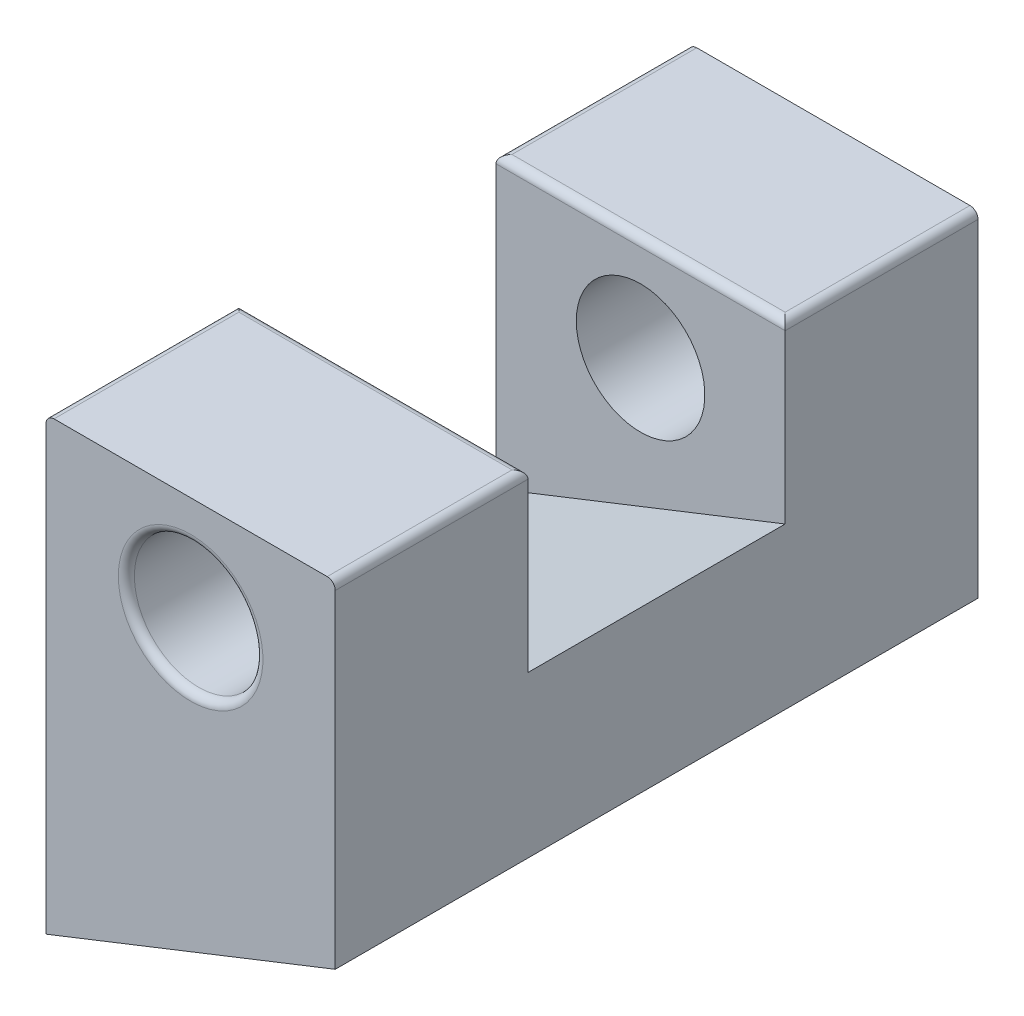
ISO-10303-21;
HEADER;
FILE_DESCRIPTION(('STEP AP214'),'2;1');
FILE_NAME('part.step','',(''),(''),'','','');
FILE_SCHEMA(('AUTOMOTIVE_DESIGN { 1 0 10303 214 1 1 1 1 }'));
ENDSEC;
DATA;
#1=APPLICATION_CONTEXT('core data for automotive mechanical design processes');
#2=APPLICATION_PROTOCOL_DEFINITION('international standard','automotive_design',2000,#1);
#3=PRODUCT_CONTEXT('',#1,'mechanical');
#4=PRODUCT('Part','Part','',(#3));
#5=PRODUCT_RELATED_PRODUCT_CATEGORY('part','',(#4));
#6=PRODUCT_DEFINITION_FORMATION('','',#4);
#7=PRODUCT_DEFINITION_CONTEXT('part definition',#1,'design');
#8=PRODUCT_DEFINITION('design','',#6,#7);
#9=PRODUCT_DEFINITION_SHAPE('','',#8);
#10=(LENGTH_UNIT() NAMED_UNIT(*) SI_UNIT(.MILLI.,.METRE.));
#11=(NAMED_UNIT(*) PLANE_ANGLE_UNIT() SI_UNIT($,.RADIAN.));
#12=(NAMED_UNIT(*) SI_UNIT($,.STERADIAN.) SOLID_ANGLE_UNIT());
#13=UNCERTAINTY_MEASURE_WITH_UNIT(LENGTH_MEASURE(1.E-05),#10,'distance_accuracy_value','');
#14=(GEOMETRIC_REPRESENTATION_CONTEXT(3) GLOBAL_UNCERTAINTY_ASSIGNED_CONTEXT((#13)) GLOBAL_UNIT_ASSIGNED_CONTEXT((#10,
#11,#12)) REPRESENTATION_CONTEXT('',''));
#15=CARTESIAN_POINT('',(0.,0.,0.));
#16=DIRECTION('',(0.,0.,1.));
#17=DIRECTION('',(1.,0.,0.));
#18=AXIS2_PLACEMENT_3D('',#15,#16,#17);
#19=CARTESIAN_POINT('',(0.,0.,20.));
#20=DIRECTION('',(0.,-1.,0.));
#21=DIRECTION('',(0.,0.,-1.));
#22=AXIS2_PLACEMENT_3D('',#19,#20,#21);
#23=PLANE('',#22);
#24=DIRECTION('',(-1.,0.,0.));
#25=VECTOR('',#24,1.);
#26=CARTESIAN_POINT('',(0.,0.,8.5));
#27=LINE('',#26,#25);
#28=CARTESIAN_POINT('',(17.5,0.,8.5));
#29=VERTEX_POINT('',#28);
#30=CARTESIAN_POINT('',(0.5,0.,8.5));
#31=VERTEX_POINT('',#30);
#32=EDGE_CURVE('E48',#29,#31,#27,.T.);
#33=ORIENTED_EDGE('',*,*,#32,.T.);
#34=DIRECTION('',(0.,0.,-1.));
#35=VECTOR('',#34,1.);
#36=CARTESIAN_POINT('',(0.5,0.,20.));
#37=LINE('',#36,#35);
#38=CARTESIAN_POINT('',(0.5,0.,20.));
#39=VERTEX_POINT('',#38);
#40=EDGE_CURVE('E201',#31,#39,#37,.F.);
#41=ORIENTED_EDGE('',*,*,#40,.T.);
#42=DIRECTION('',(-1.,0.,0.));
#43=VECTOR('',#42,1.);
#44=CARTESIAN_POINT('',(0.,0.,20.));
#45=LINE('',#44,#43);
#46=CARTESIAN_POINT('',(17.5,0.,20.));
#47=VERTEX_POINT('',#46);
#48=EDGE_CURVE('E163',#47,#39,#45,.T.);
#49=ORIENTED_EDGE('',*,*,#48,.F.);
#50=DIRECTION('',(0.,0.,-1.));
#51=VECTOR('',#50,1.);
#52=CARTESIAN_POINT('',(17.5,0.,20.));
#53=LINE('',#52,#51);
#54=EDGE_CURVE('E53',#47,#29,#53,.T.);
#55=ORIENTED_EDGE('',*,*,#54,.T.);
#56=EDGE_LOOP('',(#33,#41,#49,#55));
#57=FACE_BOUND('',#56,.T.);
#58=ADVANCED_FACE('F33',(#57),#23,.F.);
#59=CARTESIAN_POINT('',(0.,-28.021,20.));
#60=DIRECTION('',(1.,0.,0.));
#61=DIRECTION('',(0.,0.,-1.));
#62=AXIS2_PLACEMENT_3D('',#59,#60,#61);
#63=PLANE('',#62);
#64=DIRECTION('',(0.,-1.,0.));
#65=VECTOR('',#64,1.);
#66=CARTESIAN_POINT('',(0.,-18.021,-8.));
#67=LINE('',#66,#65);
#68=CARTESIAN_POINT('',(0.,-0.500000000000007,-8.));
#69=VERTEX_POINT('',#68);
#70=CARTESIAN_POINT('',(0.,-18.021,-8.));
#71=VERTEX_POINT('',#70);
#72=EDGE_CURVE('E122',#69,#71,#67,.T.);
#73=ORIENTED_EDGE('',*,*,#72,.F.);
#74=DIRECTION('',(0.,0.,-1.));
#75=VECTOR('',#74,1.);
#76=CARTESIAN_POINT('',(0.,-0.5,20.));
#77=LINE('',#76,#75);
#78=CARTESIAN_POINT('',(0.,-0.5,-20.));
#79=VERTEX_POINT('',#78);
#80=EDGE_CURVE('E197',#69,#79,#77,.T.);
#81=ORIENTED_EDGE('',*,*,#80,.T.);
#82=DIRECTION('',(0.,-1.,0.));
#83=VECTOR('',#82,1.);
#84=CARTESIAN_POINT('',(0.,-28.021,-20.));
#85=LINE('',#84,#83);
#86=CARTESIAN_POINT('',(0.,-28.021,-20.));
#87=VERTEX_POINT('',#86);
#88=EDGE_CURVE('E150',#79,#87,#85,.T.);
#89=ORIENTED_EDGE('',*,*,#88,.T.);
#90=DIRECTION('',(0.,0.,-1.));
#91=VECTOR('',#90,1.);
#92=CARTESIAN_POINT('',(0.,-28.021,20.));
#93=LINE('',#92,#91);
#94=CARTESIAN_POINT('',(0.,-28.021,20.));
#95=VERTEX_POINT('',#94);
#96=EDGE_CURVE('E177',#95,#87,#93,.T.);
#97=ORIENTED_EDGE('',*,*,#96,.F.);
#98=DIRECTION('',(0.,-1.,0.));
#99=VECTOR('',#98,1.);
#100=CARTESIAN_POINT('',(0.,-28.021,20.));
#101=LINE('',#100,#99);
#102=CARTESIAN_POINT('',(0.,-0.5,20.));
#103=VERTEX_POINT('',#102);
#104=EDGE_CURVE('E155',#103,#95,#101,.T.);
#105=ORIENTED_EDGE('',*,*,#104,.F.);
#106=DIRECTION('',(0.,0.,-1.));
#107=VECTOR('',#106,1.);
#108=CARTESIAN_POINT('',(0.,-0.5,20.));
#109=LINE('',#108,#107);
#110=CARTESIAN_POINT('',(0.,-0.500000000000007,8.));
#111=VERTEX_POINT('',#110);
#112=EDGE_CURVE('E195',#103,#111,#109,.T.);
#113=ORIENTED_EDGE('',*,*,#112,.T.);
#114=DIRECTION('',(0.,-1.,0.));
#115=VECTOR('',#114,1.);
#116=CARTESIAN_POINT('',(0.,-18.021,8.));
#117=LINE('',#116,#115);
#118=CARTESIAN_POINT('',(0.,-18.021,8.));
#119=VERTEX_POINT('',#118);
#120=EDGE_CURVE('E148',#111,#119,#117,.T.);
#121=ORIENTED_EDGE('',*,*,#120,.T.);
#122=DIRECTION('',(0.,0.,1.));
#123=VECTOR('',#122,1.);
#124=CARTESIAN_POINT('',(0.,-18.021,-8.));
#125=LINE('',#124,#123);
#126=EDGE_CURVE('E139',#71,#119,#125,.T.);
#127=ORIENTED_EDGE('',*,*,#126,.F.);
#128=EDGE_LOOP('',(#73,#81,#89,#97,#105,#113,#121,#127));
#129=FACE_BOUND('',#128,.T.);
#130=ADVANCED_FACE('F145',(#129),#63,.F.);
#131=CARTESIAN_POINT('',(18.,-20.916,20.));
#132=DIRECTION('',(-0.367154769153486,0.930159865554223,0.));
#133=DIRECTION('',(-0.930159865554223,-0.367154769153486,0.));
#134=AXIS2_PLACEMENT_3D('',#131,#132,#133);
#135=PLANE('',#134);
#136=DIRECTION('',(0.930159865554223,0.367154769153486,0.));
#137=VECTOR('',#136,1.);
#138=CARTESIAN_POINT('',(18.,-20.916,-20.));
#139=LINE('',#138,#137);
#140=CARTESIAN_POINT('',(18.,-20.916,-20.));
#141=VERTEX_POINT('',#140);
#142=EDGE_CURVE('E168',#87,#141,#139,.T.);
#143=ORIENTED_EDGE('',*,*,#142,.T.);
#144=DIRECTION('',(0.,0.,-1.));
#145=VECTOR('',#144,1.);
#146=CARTESIAN_POINT('',(18.,-20.916,20.));
#147=LINE('',#146,#145);
#148=CARTESIAN_POINT('',(18.,-20.916,20.));
#149=VERTEX_POINT('',#148);
#150=EDGE_CURVE('E166',#149,#141,#147,.T.);
#151=ORIENTED_EDGE('',*,*,#150,.F.);
#152=DIRECTION('',(0.930159865554223,0.367154769153486,0.));
#153=VECTOR('',#152,1.);
#154=CARTESIAN_POINT('',(18.,-20.916,20.));
#155=LINE('',#154,#153);
#156=EDGE_CURVE('E157',#95,#149,#155,.T.);
#157=ORIENTED_EDGE('',*,*,#156,.F.);
#158=ORIENTED_EDGE('',*,*,#96,.T.);
#159=EDGE_LOOP('',(#143,#151,#157,#158));
#160=FACE_BOUND('',#159,.T.);
#161=ADVANCED_FACE('F251',(#160),#135,.F.);
#162=CARTESIAN_POINT('',(18.,0.,20.));
#163=DIRECTION('',(-1.,0.,0.));
#164=DIRECTION('',(0.,-1.,0.));
#165=AXIS2_PLACEMENT_3D('',#162,#163,#164);
#166=PLANE('',#165);
#167=DIRECTION('',(0.,1.,0.));
#168=VECTOR('',#167,1.);
#169=CARTESIAN_POINT('',(18.,0.,-20.));
#170=LINE('',#169,#168);
#171=CARTESIAN_POINT('',(18.,-0.5,-20.));
#172=VERTEX_POINT('',#171);
#173=EDGE_CURVE('E170',#141,#172,#170,.T.);
#174=ORIENTED_EDGE('',*,*,#173,.T.);
#175=DIRECTION('',(0.,0.,-1.));
#176=VECTOR('',#175,1.);
#177=CARTESIAN_POINT('',(18.,-0.5,20.));
#178=LINE('',#177,#176);
#179=CARTESIAN_POINT('',(18.,-0.5,-8.));
#180=VERTEX_POINT('',#179);
#181=EDGE_CURVE('E193',#172,#180,#178,.F.);
#182=ORIENTED_EDGE('',*,*,#181,.T.);
#183=DIRECTION('',(0.,1.,0.));
#184=VECTOR('',#183,1.);
#185=CARTESIAN_POINT('',(18.,0.,-8.));
#186=LINE('',#185,#184);
#187=CARTESIAN_POINT('',(18.,-10.916,-8.));
#188=VERTEX_POINT('',#187);
#189=EDGE_CURVE('E143',#188,#180,#186,.T.);
#190=ORIENTED_EDGE('',*,*,#189,.F.);
#191=DIRECTION('',(0.,0.,1.));
#192=VECTOR('',#191,1.);
#193=CARTESIAN_POINT('',(18.,-10.916,-8.));
#194=LINE('',#193,#192);
#195=CARTESIAN_POINT('',(18.,-10.916,8.));
#196=VERTEX_POINT('',#195);
#197=EDGE_CURVE('E142',#188,#196,#194,.T.);
#198=ORIENTED_EDGE('',*,*,#197,.T.);
#199=DIRECTION('',(0.,1.,0.));
#200=VECTOR('',#199,1.);
#201=CARTESIAN_POINT('',(18.,0.,8.));
#202=LINE('',#201,#200);
#203=CARTESIAN_POINT('',(18.,-0.5,8.));
#204=VERTEX_POINT('',#203);
#205=EDGE_CURVE('E133',#196,#204,#202,.T.);
#206=ORIENTED_EDGE('',*,*,#205,.T.);
#207=DIRECTION('',(0.,0.,-1.));
#208=VECTOR('',#207,1.);
#209=CARTESIAN_POINT('',(18.,-0.5,20.));
#210=LINE('',#209,#208);
#211=CARTESIAN_POINT('',(18.,-0.5,20.));
#212=VERTEX_POINT('',#211);
#213=EDGE_CURVE('E191',#204,#212,#210,.F.);
#214=ORIENTED_EDGE('',*,*,#213,.T.);
#215=DIRECTION('',(0.,1.,0.));
#216=VECTOR('',#215,1.);
#217=CARTESIAN_POINT('',(18.,0.,20.));
#218=LINE('',#217,#216);
#219=EDGE_CURVE('E160',#149,#212,#218,.T.);
#220=ORIENTED_EDGE('',*,*,#219,.F.);
#221=ORIENTED_EDGE('',*,*,#150,.T.);
#222=EDGE_LOOP('',(#174,#182,#190,#198,#206,#214,#220,#221));
#223=FACE_BOUND('',#222,.T.);
#224=ADVANCED_FACE('F257',(#223),#166,.F.);
#225=DIRECTION('',(-1.,0.,0.));
#226=VECTOR('',#225,1.);
#227=CARTESIAN_POINT('',(0.,0.,-8.5));
#228=LINE('',#227,#226);
#229=CARTESIAN_POINT('',(0.5,0.,-8.5));
#230=VERTEX_POINT('',#229);
#231=CARTESIAN_POINT('',(17.5,0.,-8.5));
#232=VERTEX_POINT('',#231);
#233=EDGE_CURVE('E180',#230,#232,#228,.F.);
#234=ORIENTED_EDGE('',*,*,#233,.T.);
#235=DIRECTION('',(0.,0.,-1.));
#236=VECTOR('',#235,1.);
#237=CARTESIAN_POINT('',(17.5,0.,20.));
#238=LINE('',#237,#236);
#239=CARTESIAN_POINT('',(17.5,0.,-20.));
#240=VERTEX_POINT('',#239);
#241=EDGE_CURVE('E184',#232,#240,#238,.T.);
#242=ORIENTED_EDGE('',*,*,#241,.T.);
#243=DIRECTION('',(-1.,0.,0.));
#244=VECTOR('',#243,1.);
#245=CARTESIAN_POINT('',(0.,0.,-20.));
#246=LINE('',#245,#244);
#247=CARTESIAN_POINT('',(0.5,0.,-20.));
#248=VERTEX_POINT('',#247);
#249=EDGE_CURVE('E158',#240,#248,#246,.T.);
#250=ORIENTED_EDGE('',*,*,#249,.T.);
#251=DIRECTION('',(0.,0.,-1.));
#252=VECTOR('',#251,1.);
#253=CARTESIAN_POINT('',(0.5,0.,20.));
#254=LINE('',#253,#252);
#255=EDGE_CURVE('E182',#248,#230,#254,.F.);
#256=ORIENTED_EDGE('',*,*,#255,.T.);
#257=EDGE_LOOP('',(#234,#242,#250,#256));
#258=FACE_BOUND('',#257,.T.);
#259=ADVANCED_FACE('F247',(#258),#23,.F.);
#260=CARTESIAN_POINT('',(0.,0.,20.));
#261=DIRECTION('',(0.,0.,-1.));
#262=DIRECTION('',(-1.,0.,0.));
#263=AXIS2_PLACEMENT_3D('',#260,#261,#262);
#264=PLANE('',#263);
#265=CARTESIAN_POINT('',(9.,-6.4685,20.));
#266=DIRECTION('',(0.,0.,-1.));
#267=DIRECTION('',(-1.,0.,0.));
#268=AXIS2_PLACEMENT_3D('',#265,#266,#267);
#269=CIRCLE('',#268,4.5);
#270=CARTESIAN_POINT('',(4.5,-6.4685,20.));
#271=VERTEX_POINT('',#270);
#272=EDGE_CURVE('E11',#271,#271,#269,.T.);
#273=ORIENTED_EDGE('',*,*,#272,.T.);
#274=EDGE_LOOP('',(#273));
#275=FACE_BOUND('',#274,.T.);
#276=ORIENTED_EDGE('',*,*,#48,.T.);
#277=CARTESIAN_POINT('',(0.5,-0.5,20.));
#278=DIRECTION('',(0.,0.,-1.));
#279=DIRECTION('',(-1.,0.,0.));
#280=AXIS2_PLACEMENT_3D('',#277,#278,#279);
#281=CIRCLE('',#280,0.5);
#282=EDGE_CURVE('E205',#39,#103,#281,.F.);
#283=ORIENTED_EDGE('',*,*,#282,.T.);
#284=ORIENTED_EDGE('',*,*,#104,.T.);
#285=ORIENTED_EDGE('',*,*,#156,.T.);
#286=ORIENTED_EDGE('',*,*,#219,.T.);
#287=CARTESIAN_POINT('',(17.5,-0.5,20.));
#288=DIRECTION('',(0.,0.,-1.));
#289=DIRECTION('',(-1.,0.,0.));
#290=AXIS2_PLACEMENT_3D('',#287,#288,#289);
#291=CIRCLE('',#290,0.5);
#292=EDGE_CURVE('E203',#212,#47,#291,.F.);
#293=ORIENTED_EDGE('',*,*,#292,.T.);
#294=EDGE_LOOP('',(#276,#283,#284,#285,#286,#293));
#295=FACE_BOUND('',#294,.T.);
#296=ADVANCED_FACE('F256',(#275,#295),#264,.F.);
#297=CARTESIAN_POINT('',(0.,0.,-20.));
#298=DIRECTION('',(0.,0.,-1.));
#299=DIRECTION('',(-1.,0.,0.));
#300=AXIS2_PLACEMENT_3D('',#297,#298,#299);
#301=PLANE('',#300);
#302=CARTESIAN_POINT('',(9.,-6.4685,-20.));
#303=DIRECTION('',(0.,0.,-1.));
#304=DIRECTION('',(-1.,0.,0.));
#305=AXIS2_PLACEMENT_3D('',#302,#303,#304);
#306=CIRCLE('',#305,4.5);
#307=CARTESIAN_POINT('',(4.5,-6.4685,-20.));
#308=VERTEX_POINT('',#307);
#309=EDGE_CURVE('E210',#308,#308,#306,.F.);
#310=ORIENTED_EDGE('',*,*,#309,.T.);
#311=EDGE_LOOP('',(#310));
#312=FACE_BOUND('',#311,.T.);
#313=ORIENTED_EDGE('',*,*,#249,.F.);
#314=CARTESIAN_POINT('',(17.5,-0.5,-20.));
#315=DIRECTION('',(0.,0.,-1.));
#316=DIRECTION('',(-1.,0.,0.));
#317=AXIS2_PLACEMENT_3D('',#314,#315,#316);
#318=CIRCLE('',#317,0.5);
#319=EDGE_CURVE('E189',#240,#172,#318,.T.);
#320=ORIENTED_EDGE('',*,*,#319,.T.);
#321=ORIENTED_EDGE('',*,*,#173,.F.);
#322=ORIENTED_EDGE('',*,*,#142,.F.);
#323=ORIENTED_EDGE('',*,*,#88,.F.);
#324=CARTESIAN_POINT('',(0.5,-0.5,-20.));
#325=DIRECTION('',(0.,0.,-1.));
#326=DIRECTION('',(-1.,0.,0.));
#327=AXIS2_PLACEMENT_3D('',#324,#325,#326);
#328=CIRCLE('',#327,0.5);
#329=EDGE_CURVE('E187',#79,#248,#328,.T.);
#330=ORIENTED_EDGE('',*,*,#329,.T.);
#331=EDGE_LOOP('',(#313,#320,#321,#322,#323,#330));
#332=FACE_BOUND('',#331,.T.);
#333=ADVANCED_FACE('F264',(#312,#332),#301,.T.);
#334=CARTESIAN_POINT('',(0.,-18.021,-8.));
#335=DIRECTION('',(0.367154769153486,-0.930159865554223,0.));
#336=DIRECTION('',(0.930159865554223,0.367154769153486,0.));
#337=AXIS2_PLACEMENT_3D('',#334,#335,#336);
#338=PLANE('',#337);
#339=DIRECTION('',(0.930159865554223,0.367154769153486,0.));
#340=VECTOR('',#339,1.);
#341=CARTESIAN_POINT('',(0.,-18.021,8.));
#342=LINE('',#341,#340);
#343=EDGE_CURVE('E328',#119,#196,#342,.T.);
#344=ORIENTED_EDGE('',*,*,#343,.T.);
#345=ORIENTED_EDGE('',*,*,#197,.F.);
#346=DIRECTION('',(0.930159865554223,0.367154769153486,0.));
#347=VECTOR('',#346,1.);
#348=CARTESIAN_POINT('',(0.,-18.021,-8.));
#349=LINE('',#348,#347);
#350=EDGE_CURVE('E126',#71,#188,#349,.T.);
#351=ORIENTED_EDGE('',*,*,#350,.F.);
#352=ORIENTED_EDGE('',*,*,#126,.T.);
#353=EDGE_LOOP('',(#344,#345,#351,#352));
#354=FACE_BOUND('',#353,.T.);
#355=ADVANCED_FACE('F138',(#354),#338,.F.);
#356=CARTESIAN_POINT('',(0.,0.,-8.));
#357=DIRECTION('',(0.,0.,-1.));
#358=DIRECTION('',(-1.,0.,0.));
#359=AXIS2_PLACEMENT_3D('',#356,#357,#358);
#360=PLANE('',#359);
#361=CARTESIAN_POINT('',(9.,-6.4685,-8.));
#362=DIRECTION('',(0.,0.,-1.));
#363=DIRECTION('',(-1.,0.,0.));
#364=AXIS2_PLACEMENT_3D('',#361,#362,#363);
#365=CIRCLE('',#364,4.);
#366=CARTESIAN_POINT('',(5.,-6.4685,-8.));
#367=VERTEX_POINT('',#366);
#368=EDGE_CURVE('E220',#367,#367,#365,.T.);
#369=ORIENTED_EDGE('',*,*,#368,.T.);
#370=EDGE_LOOP('',(#369));
#371=FACE_BOUND('',#370,.T.);
#372=ORIENTED_EDGE('',*,*,#189,.T.);
#373=DIRECTION('',(-1.,0.,0.));
#374=VECTOR('',#373,1.);
#375=CARTESIAN_POINT('',(0.,-0.5,-8.));
#376=LINE('',#375,#374);
#377=EDGE_CURVE('E129',#180,#69,#376,.T.);
#378=ORIENTED_EDGE('',*,*,#377,.T.);
#379=ORIENTED_EDGE('',*,*,#72,.T.);
#380=ORIENTED_EDGE('',*,*,#350,.T.);
#381=EDGE_LOOP('',(#372,#378,#379,#380));
#382=FACE_BOUND('',#381,.T.);
#383=ADVANCED_FACE('F125',(#371,#382),#360,.F.);
#384=CARTESIAN_POINT('',(0.,0.,8.));
#385=DIRECTION('',(0.,0.,-1.));
#386=DIRECTION('',(-1.,0.,0.));
#387=AXIS2_PLACEMENT_3D('',#384,#385,#386);
#388=PLANE('',#387);
#389=CARTESIAN_POINT('',(9.,-6.4685,8.));
#390=DIRECTION('',(0.,0.,-1.));
#391=DIRECTION('',(-1.,0.,0.));
#392=AXIS2_PLACEMENT_3D('',#389,#390,#391);
#393=CIRCLE('',#392,4.);
#394=CARTESIAN_POINT('',(5.,-6.4685,8.));
#395=VERTEX_POINT('',#394);
#396=EDGE_CURVE('E223',#395,#395,#393,.T.);
#397=ORIENTED_EDGE('',*,*,#396,.F.);
#398=EDGE_LOOP('',(#397));
#399=FACE_BOUND('',#398,.T.);
#400=ORIENTED_EDGE('',*,*,#120,.F.);
#401=DIRECTION('',(-1.,0.,0.));
#402=VECTOR('',#401,1.);
#403=CARTESIAN_POINT('',(18.,-0.5,8.));
#404=LINE('',#403,#402);
#405=EDGE_CURVE('E207',#111,#204,#404,.F.);
#406=ORIENTED_EDGE('',*,*,#405,.T.);
#407=ORIENTED_EDGE('',*,*,#205,.F.);
#408=ORIENTED_EDGE('',*,*,#343,.F.);
#409=EDGE_LOOP('',(#400,#406,#407,#408));
#410=FACE_BOUND('',#409,.T.);
#411=ADVANCED_FACE('F292',(#399,#410),#388,.T.);
#412=CARTESIAN_POINT('',(0.5,-0.5,20.));
#413=DIRECTION('',(0.,0.,-1.));
#414=DIRECTION('',(-1.,0.,0.));
#415=AXIS2_PLACEMENT_3D('',#412,#413,#414);
#416=CYLINDRICAL_SURFACE('',#415,0.5);
#417=ORIENTED_EDGE('',*,*,#329,.F.);
#418=ORIENTED_EDGE('',*,*,#80,.F.);
#419=CARTESIAN_POINT('',(0.5,-0.5,-8.5));
#420=DIRECTION('',(-0.707106781186547,0.,-0.707106781186547));
#421=DIRECTION('',(-0.707106781186547,0.,0.707106781186547));
#422=AXIS2_PLACEMENT_3D('',#419,#420,#421);
#423=ELLIPSE('',#422,0.707106781186547,0.5);
#424=EDGE_CURVE('E214',#230,#69,#423,.F.);
#425=ORIENTED_EDGE('',*,*,#424,.F.);
#426=ORIENTED_EDGE('',*,*,#255,.F.);
#427=EDGE_LOOP('',(#417,#418,#425,#426));
#428=FACE_BOUND('',#427,.T.);
#429=ADVANCED_FACE('F290',(#428),#416,.T.);
#430=CARTESIAN_POINT('',(0.,-0.5,-8.5));
#431=DIRECTION('',(-1.,0.,0.));
#432=DIRECTION('',(0.,0.,1.));
#433=AXIS2_PLACEMENT_3D('',#430,#431,#432);
#434=CYLINDRICAL_SURFACE('',#433,0.5);
#435=ORIENTED_EDGE('',*,*,#424,.T.);
#436=ORIENTED_EDGE('',*,*,#377,.F.);
#437=CARTESIAN_POINT('',(17.5,-0.5,-8.5));
#438=DIRECTION('',(-0.707106781186547,0.,0.707106781186547));
#439=DIRECTION('',(-0.707106781186547,0.,-0.707106781186547));
#440=AXIS2_PLACEMENT_3D('',#437,#438,#439);
#441=ELLIPSE('',#440,0.707106781186547,0.5);
#442=EDGE_CURVE('E211',#232,#180,#441,.F.);
#443=ORIENTED_EDGE('',*,*,#442,.F.);
#444=ORIENTED_EDGE('',*,*,#233,.F.);
#445=EDGE_LOOP('',(#435,#436,#443,#444));
#446=FACE_BOUND('',#445,.T.);
#447=ADVANCED_FACE('F275',(#446),#434,.T.);
#448=CARTESIAN_POINT('',(17.5,-0.5,20.));
#449=DIRECTION('',(0.,0.,-1.));
#450=DIRECTION('',(-1.,0.,0.));
#451=AXIS2_PLACEMENT_3D('',#448,#449,#450);
#452=CYLINDRICAL_SURFACE('',#451,0.5);
#453=ORIENTED_EDGE('',*,*,#442,.T.);
#454=ORIENTED_EDGE('',*,*,#181,.F.);
#455=ORIENTED_EDGE('',*,*,#319,.F.);
#456=ORIENTED_EDGE('',*,*,#241,.F.);
#457=EDGE_LOOP('',(#453,#454,#455,#456));
#458=FACE_BOUND('',#457,.T.);
#459=ADVANCED_FACE('F278',(#458),#452,.T.);
#460=CARTESIAN_POINT('',(17.5,-0.5,20.));
#461=DIRECTION('',(0.,0.,-1.));
#462=DIRECTION('',(-1.,0.,0.));
#463=AXIS2_PLACEMENT_3D('',#460,#461,#462);
#464=CYLINDRICAL_SURFACE('',#463,0.5);
#465=ORIENTED_EDGE('',*,*,#292,.F.);
#466=ORIENTED_EDGE('',*,*,#213,.F.);
#467=CARTESIAN_POINT('',(17.5,-0.5,8.5));
#468=DIRECTION('',(0.707106781186547,0.,0.707106781186547));
#469=DIRECTION('',(0.707106781186547,0.,-0.707106781186547));
#470=AXIS2_PLACEMENT_3D('',#467,#468,#469);
#471=ELLIPSE('',#470,0.707106781186547,0.5);
#472=EDGE_CURVE('E215',#29,#204,#471,.F.);
#473=ORIENTED_EDGE('',*,*,#472,.F.);
#474=ORIENTED_EDGE('',*,*,#54,.F.);
#475=EDGE_LOOP('',(#465,#466,#473,#474));
#476=FACE_BOUND('',#475,.T.);
#477=ADVANCED_FACE('F311',(#476),#464,.T.);
#478=CARTESIAN_POINT('',(0.,-0.5,8.5));
#479=DIRECTION('',(1.,0.,0.));
#480=DIRECTION('',(0.,0.,-1.));
#481=AXIS2_PLACEMENT_3D('',#478,#479,#480);
#482=CYLINDRICAL_SURFACE('',#481,0.5);
#483=ORIENTED_EDGE('',*,*,#472,.T.);
#484=ORIENTED_EDGE('',*,*,#405,.F.);
#485=CARTESIAN_POINT('',(0.5,-0.5,8.5));
#486=DIRECTION('',(0.707106781186547,0.,-0.707106781186547));
#487=DIRECTION('',(0.707106781186547,0.,0.707106781186547));
#488=AXIS2_PLACEMENT_3D('',#485,#486,#487);
#489=ELLIPSE('',#488,0.707106781186547,0.5);
#490=EDGE_CURVE('E218',#31,#111,#489,.F.);
#491=ORIENTED_EDGE('',*,*,#490,.F.);
#492=ORIENTED_EDGE('',*,*,#32,.F.);
#493=EDGE_LOOP('',(#483,#484,#491,#492));
#494=FACE_BOUND('',#493,.T.);
#495=ADVANCED_FACE('F307',(#494),#482,.T.);
#496=CARTESIAN_POINT('',(0.5,-0.5,20.));
#497=DIRECTION('',(0.,0.,-1.));
#498=DIRECTION('',(-1.,0.,0.));
#499=AXIS2_PLACEMENT_3D('',#496,#497,#498);
#500=CYLINDRICAL_SURFACE('',#499,0.5);
#501=ORIENTED_EDGE('',*,*,#282,.F.);
#502=ORIENTED_EDGE('',*,*,#40,.F.);
#503=ORIENTED_EDGE('',*,*,#490,.T.);
#504=ORIENTED_EDGE('',*,*,#112,.F.);
#505=EDGE_LOOP('',(#501,#502,#503,#504));
#506=FACE_BOUND('',#505,.T.);
#507=ADVANCED_FACE('F304',(#506),#500,.T.);
#508=CARTESIAN_POINT('',(9.,-6.4685,-20.));
#509=DIRECTION('',(0.,0.,1.));
#510=DIRECTION('',(1.,0.,0.));
#511=AXIS2_PLACEMENT_3D('',#508,#509,#510);
#512=CYLINDRICAL_SURFACE('',#511,4.);
#513=CARTESIAN_POINT('',(9.,-6.4685,19.5));
#514=DIRECTION('',(0.,0.,-1.));
#515=DIRECTION('',(-1.,0.,0.));
#516=AXIS2_PLACEMENT_3D('',#513,#514,#515);
#517=CIRCLE('',#516,4.);
#518=CARTESIAN_POINT('',(5.,-6.4685,19.5));
#519=VERTEX_POINT('',#518);
#520=EDGE_CURVE('E41',#519,#519,#517,.F.);
#521=ORIENTED_EDGE('',*,*,#520,.T.);
#522=EDGE_LOOP('',(#521));
#523=FACE_BOUND('',#522,.T.);
#524=ORIENTED_EDGE('',*,*,#396,.T.);
#525=EDGE_LOOP('',(#524));
#526=FACE_BOUND('',#525,.T.);
#527=ADVANCED_FACE('F233',(#523,#526),#512,.F.);
#528=CARTESIAN_POINT('',(9.,-6.4685,-19.5));
#529=DIRECTION('',(0.,0.,-1.));
#530=DIRECTION('',(-1.,0.,0.));
#531=AXIS2_PLACEMENT_3D('',#528,#529,#530);
#532=CIRCLE('',#531,4.);
#533=CARTESIAN_POINT('',(5.,-6.4685,-19.5));
#534=VERTEX_POINT('',#533);
#535=EDGE_CURVE('E228',#534,#534,#532,.T.);
#536=ORIENTED_EDGE('',*,*,#535,.T.);
#537=EDGE_LOOP('',(#536));
#538=FACE_BOUND('',#537,.T.);
#539=ORIENTED_EDGE('',*,*,#368,.F.);
#540=EDGE_LOOP('',(#539));
#541=FACE_BOUND('',#540,.T.);
#542=ADVANCED_FACE('F242',(#538,#541),#512,.F.);
#543=CARTESIAN_POINT('',(9.,-6.4685,-19.5));
#544=DIRECTION('',(0.,0.,-1.));
#545=DIRECTION('',(-1.,0.,0.));
#546=AXIS2_PLACEMENT_3D('',#543,#544,#545);
#547=TOROIDAL_SURFACE('',#546,4.5,0.5);
#548=ORIENTED_EDGE('',*,*,#535,.F.);
#549=EDGE_LOOP('',(#548));
#550=FACE_BOUND('',#549,.T.);
#551=ORIENTED_EDGE('',*,*,#309,.F.);
#552=EDGE_LOOP('',(#551));
#553=FACE_BOUND('',#552,.T.);
#554=ADVANCED_FACE('F237',(#550,#553),#547,.T.);
#555=CARTESIAN_POINT('',(9.,-6.4685,19.5));
#556=DIRECTION('',(0.,0.,-1.));
#557=DIRECTION('',(-1.,0.,0.));
#558=AXIS2_PLACEMENT_3D('',#555,#556,#557);
#559=TOROIDAL_SURFACE('',#558,4.5,0.5);
#560=ORIENTED_EDGE('',*,*,#272,.F.);
#561=EDGE_LOOP('',(#560));
#562=FACE_BOUND('',#561,.T.);
#563=ORIENTED_EDGE('',*,*,#520,.F.);
#564=EDGE_LOOP('',(#563));
#565=FACE_BOUND('',#564,.T.);
#566=ADVANCED_FACE('F35',(#562,#565),#559,.T.);
#567=CLOSED_SHELL('',(#58,#130,#161,#224,#259,#296,#333,#355,#383,#411,#429,#447,#459,#477,#495,
#507,#527,#542,#554,#566));
#568=MANIFOLD_SOLID_BREP('B2',#567);
#569=ADVANCED_BREP_SHAPE_REPRESENTATION('',(#18,#568),#14);
#570=SHAPE_DEFINITION_REPRESENTATION(#9,#569);
ENDSEC;
END-ISO-10303-21;
